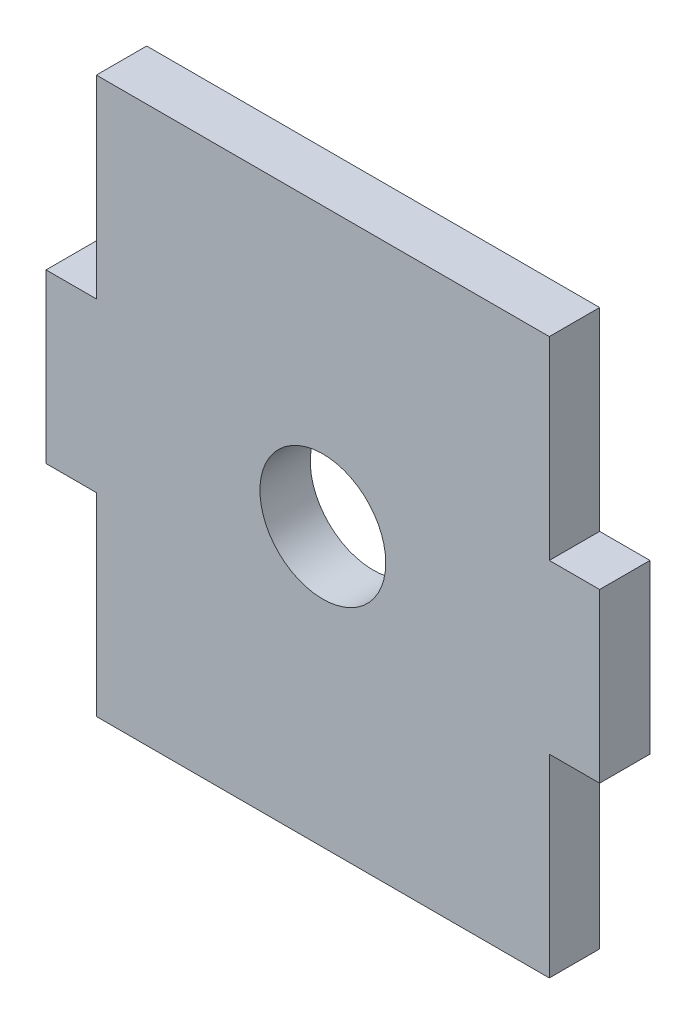
ISO-10303-21;
HEADER;
FILE_DESCRIPTION(('STEP AP214'),'2;1');
FILE_NAME('part.step','',(''),(''),'','','');
FILE_SCHEMA(('AUTOMOTIVE_DESIGN { 1 0 10303 214 1 1 1 1 }'));
ENDSEC;
DATA;
#1=APPLICATION_CONTEXT('core data for automotive mechanical design processes');
#2=APPLICATION_PROTOCOL_DEFINITION('international standard','automotive_design',2000,#1);
#3=PRODUCT_CONTEXT('',#1,'mechanical');
#4=PRODUCT('Part','Part','',(#3));
#5=PRODUCT_RELATED_PRODUCT_CATEGORY('part','',(#4));
#6=PRODUCT_DEFINITION_FORMATION('','',#4);
#7=PRODUCT_DEFINITION_CONTEXT('part definition',#1,'design');
#8=PRODUCT_DEFINITION('design','',#6,#7);
#9=PRODUCT_DEFINITION_SHAPE('','',#8);
#10=(LENGTH_UNIT() NAMED_UNIT(*) SI_UNIT(.MILLI.,.METRE.));
#11=(NAMED_UNIT(*) PLANE_ANGLE_UNIT() SI_UNIT($,.RADIAN.));
#12=(NAMED_UNIT(*) SI_UNIT($,.STERADIAN.) SOLID_ANGLE_UNIT());
#13=UNCERTAINTY_MEASURE_WITH_UNIT(LENGTH_MEASURE(1.E-05),#10,'distance_accuracy_value','');
#14=(GEOMETRIC_REPRESENTATION_CONTEXT(3) GLOBAL_UNCERTAINTY_ASSIGNED_CONTEXT((#13)) GLOBAL_UNIT_ASSIGNED_CONTEXT((#10,
#11,#12)) REPRESENTATION_CONTEXT('',''));
#15=CARTESIAN_POINT('',(0.,0.,0.));
#16=DIRECTION('',(0.,0.,1.));
#17=DIRECTION('',(1.,0.,0.));
#18=AXIS2_PLACEMENT_3D('',#15,#16,#17);
#19=CARTESIAN_POINT('',(0.,0.,3.));
#20=DIRECTION('',(0.,0.,-1.));
#21=DIRECTION('',(-1.,0.,0.));
#22=AXIS2_PLACEMENT_3D('',#19,#20,#21);
#23=PLANE('',#22);
#24=DIRECTION('',(0.,1.,0.));
#25=VECTOR('',#24,1.);
#26=CARTESIAN_POINT('',(13.5,5.,3.));
#27=LINE('',#26,#25);
#28=CARTESIAN_POINT('',(13.5,5.,3.));
#29=VERTEX_POINT('',#28);
#30=CARTESIAN_POINT('',(13.5,16.556349185,3.));
#31=VERTEX_POINT('',#30);
#32=EDGE_CURVE('E176',#29,#31,#27,.T.);
#33=ORIENTED_EDGE('',*,*,#32,.T.);
#34=DIRECTION('',(-1.,0.,0.));
#35=VECTOR('',#34,1.);
#36=CARTESIAN_POINT('',(-13.5,16.556349185,3.));
#37=LINE('',#36,#35);
#38=CARTESIAN_POINT('',(-13.5,16.556349185,3.));
#39=VERTEX_POINT('',#38);
#40=EDGE_CURVE('E104',#31,#39,#37,.T.);
#41=ORIENTED_EDGE('',*,*,#40,.T.);
#42=DIRECTION('',(0.,-1.,0.));
#43=VECTOR('',#42,1.);
#44=CARTESIAN_POINT('',(-13.5,4.99999999999999,3.));
#45=LINE('',#44,#43);
#46=CARTESIAN_POINT('',(-13.5,4.99999999999999,3.));
#47=VERTEX_POINT('',#46);
#48=EDGE_CURVE('E203',#39,#47,#45,.T.);
#49=ORIENTED_EDGE('',*,*,#48,.T.);
#50=DIRECTION('',(-1.,0.,0.));
#51=VECTOR('',#50,1.);
#52=CARTESIAN_POINT('',(-16.5,4.99999999999999,3.));
#53=LINE('',#52,#51);
#54=CARTESIAN_POINT('',(-16.5,4.99999999999999,3.));
#55=VERTEX_POINT('',#54);
#56=EDGE_CURVE('E222',#47,#55,#53,.T.);
#57=ORIENTED_EDGE('',*,*,#56,.T.);
#58=DIRECTION('',(0.,-1.,0.));
#59=VECTOR('',#58,1.);
#60=CARTESIAN_POINT('',(-16.5,-5.00000000000001,3.));
#61=LINE('',#60,#59);
#62=CARTESIAN_POINT('',(-16.5,-5.00000000000001,3.));
#63=VERTEX_POINT('',#62);
#64=EDGE_CURVE('E219',#55,#63,#61,.T.);
#65=ORIENTED_EDGE('',*,*,#64,.T.);
#66=DIRECTION('',(1.,0.,0.));
#67=VECTOR('',#66,1.);
#68=CARTESIAN_POINT('',(-16.5,-5.00000000000001,3.));
#69=LINE('',#68,#67);
#70=CARTESIAN_POINT('',(-13.5,-5.,3.));
#71=VERTEX_POINT('',#70);
#72=EDGE_CURVE('E221',#63,#71,#69,.T.);
#73=ORIENTED_EDGE('',*,*,#72,.T.);
#74=DIRECTION('',(0.,-1.,0.));
#75=VECTOR('',#74,1.);
#76=CARTESIAN_POINT('',(-13.5,-16.556349185,3.));
#77=LINE('',#76,#75);
#78=CARTESIAN_POINT('',(-13.5,-16.556349185,3.));
#79=VERTEX_POINT('',#78);
#80=EDGE_CURVE('E224',#71,#79,#77,.T.);
#81=ORIENTED_EDGE('',*,*,#80,.T.);
#82=DIRECTION('',(1.,0.,0.));
#83=VECTOR('',#82,1.);
#84=CARTESIAN_POINT('',(-13.5,-16.556349185,3.));
#85=LINE('',#84,#83);
#86=CARTESIAN_POINT('',(13.5,-16.556349185,3.));
#87=VERTEX_POINT('',#86);
#88=EDGE_CURVE('E230',#79,#87,#85,.T.);
#89=ORIENTED_EDGE('',*,*,#88,.T.);
#90=DIRECTION('',(0.,1.,0.));
#91=VECTOR('',#90,1.);
#92=CARTESIAN_POINT('',(13.5,-16.556349185,3.));
#93=LINE('',#92,#91);
#94=CARTESIAN_POINT('',(13.5,-5.,3.));
#95=VERTEX_POINT('',#94);
#96=EDGE_CURVE('E135',#87,#95,#93,.T.);
#97=ORIENTED_EDGE('',*,*,#96,.T.);
#98=DIRECTION('',(1.,0.,0.));
#99=VECTOR('',#98,1.);
#100=CARTESIAN_POINT('',(16.5,-5.,3.));
#101=LINE('',#100,#99);
#102=CARTESIAN_POINT('',(16.5,-5.,3.));
#103=VERTEX_POINT('',#102);
#104=EDGE_CURVE('E129',#95,#103,#101,.T.);
#105=ORIENTED_EDGE('',*,*,#104,.T.);
#106=DIRECTION('',(0.,1.,0.));
#107=VECTOR('',#106,1.);
#108=CARTESIAN_POINT('',(16.5,-5.,3.));
#109=LINE('',#108,#107);
#110=CARTESIAN_POINT('',(16.5,5.,3.));
#111=VERTEX_POINT('',#110);
#112=EDGE_CURVE('E133',#103,#111,#109,.T.);
#113=ORIENTED_EDGE('',*,*,#112,.T.);
#114=DIRECTION('',(-1.,0.,0.));
#115=VECTOR('',#114,1.);
#116=CARTESIAN_POINT('',(16.5,5.,3.));
#117=LINE('',#116,#115);
#118=EDGE_CURVE('E49',#111,#29,#117,.T.);
#119=ORIENTED_EDGE('',*,*,#118,.T.);
#120=EDGE_LOOP('',(#33,#41,#49,#57,#65,#73,#81,#89,#97,#105,#113,#119));
#121=FACE_BOUND('',#120,.T.);
#122=CARTESIAN_POINT('',(0.,0.,3.));
#123=DIRECTION('',(0.,0.,1.));
#124=DIRECTION('',(1.,0.,0.));
#125=AXIS2_PLACEMENT_3D('',#122,#123,#124);
#126=CIRCLE('',#125,3.75);
#127=CARTESIAN_POINT('',(3.75,0.,3.));
#128=VERTEX_POINT('',#127);
#129=EDGE_CURVE('E157',#128,#128,#126,.T.);
#130=ORIENTED_EDGE('',*,*,#129,.F.);
#131=EDGE_LOOP('',(#130));
#132=FACE_BOUND('',#131,.T.);
#133=ADVANCED_FACE('F32',(#121,#132),#23,.F.);
#134=CARTESIAN_POINT('',(0.,0.,0.));
#135=DIRECTION('',(0.,0.,-1.));
#136=DIRECTION('',(-1.,0.,0.));
#137=AXIS2_PLACEMENT_3D('',#134,#135,#136);
#138=PLANE('',#137);
#139=DIRECTION('',(0.,1.,0.));
#140=VECTOR('',#139,1.);
#141=CARTESIAN_POINT('',(13.5,5.,0.));
#142=LINE('',#141,#140);
#143=CARTESIAN_POINT('',(13.5,5.,0.));
#144=VERTEX_POINT('',#143);
#145=CARTESIAN_POINT('',(13.5,16.556349185,0.));
#146=VERTEX_POINT('',#145);
#147=EDGE_CURVE('E153',#144,#146,#142,.T.);
#148=ORIENTED_EDGE('',*,*,#147,.F.);
#149=DIRECTION('',(-1.,0.,0.));
#150=VECTOR('',#149,1.);
#151=CARTESIAN_POINT('',(16.5,5.,0.));
#152=LINE('',#151,#150);
#153=CARTESIAN_POINT('',(16.5,5.,0.));
#154=VERTEX_POINT('',#153);
#155=EDGE_CURVE('E96',#154,#144,#152,.T.);
#156=ORIENTED_EDGE('',*,*,#155,.F.);
#157=DIRECTION('',(0.,1.,0.));
#158=VECTOR('',#157,1.);
#159=CARTESIAN_POINT('',(16.5,-5.,0.));
#160=LINE('',#159,#158);
#161=CARTESIAN_POINT('',(16.5,-5.,0.));
#162=VERTEX_POINT('',#161);
#163=EDGE_CURVE('E90',#162,#154,#160,.T.);
#164=ORIENTED_EDGE('',*,*,#163,.F.);
#165=DIRECTION('',(1.,0.,0.));
#166=VECTOR('',#165,1.);
#167=CARTESIAN_POINT('',(16.5,-5.,0.));
#168=LINE('',#167,#166);
#169=CARTESIAN_POINT('',(13.5,-5.,0.));
#170=VERTEX_POINT('',#169);
#171=EDGE_CURVE('E143',#170,#162,#168,.T.);
#172=ORIENTED_EDGE('',*,*,#171,.F.);
#173=DIRECTION('',(0.,1.,0.));
#174=VECTOR('',#173,1.);
#175=CARTESIAN_POINT('',(13.5,-16.556349185,0.));
#176=LINE('',#175,#174);
#177=CARTESIAN_POINT('',(13.5,-16.556349185,0.));
#178=VERTEX_POINT('',#177);
#179=EDGE_CURVE('E171',#178,#170,#176,.T.);
#180=ORIENTED_EDGE('',*,*,#179,.F.);
#181=DIRECTION('',(1.,0.,0.));
#182=VECTOR('',#181,1.);
#183=CARTESIAN_POINT('',(-13.5,-16.556349185,0.));
#184=LINE('',#183,#182);
#185=CARTESIAN_POINT('',(-13.5,-16.556349185,0.));
#186=VERTEX_POINT('',#185);
#187=EDGE_CURVE('E169',#186,#178,#184,.T.);
#188=ORIENTED_EDGE('',*,*,#187,.F.);
#189=DIRECTION('',(0.,-1.,0.));
#190=VECTOR('',#189,1.);
#191=CARTESIAN_POINT('',(-13.5,-16.556349185,0.));
#192=LINE('',#191,#190);
#193=CARTESIAN_POINT('',(-13.5,-5.,0.));
#194=VERTEX_POINT('',#193);
#195=EDGE_CURVE('E167',#194,#186,#192,.T.);
#196=ORIENTED_EDGE('',*,*,#195,.F.);
#197=DIRECTION('',(1.,0.,0.));
#198=VECTOR('',#197,1.);
#199=CARTESIAN_POINT('',(-16.5,-5.00000000000001,0.));
#200=LINE('',#199,#198);
#201=CARTESIAN_POINT('',(-16.5,-5.00000000000001,0.));
#202=VERTEX_POINT('',#201);
#203=EDGE_CURVE('E165',#202,#194,#200,.T.);
#204=ORIENTED_EDGE('',*,*,#203,.F.);
#205=DIRECTION('',(0.,-1.,0.));
#206=VECTOR('',#205,1.);
#207=CARTESIAN_POINT('',(-16.5,-5.00000000000001,0.));
#208=LINE('',#207,#206);
#209=CARTESIAN_POINT('',(-16.5,4.99999999999999,0.));
#210=VERTEX_POINT('',#209);
#211=EDGE_CURVE('E163',#210,#202,#208,.T.);
#212=ORIENTED_EDGE('',*,*,#211,.F.);
#213=DIRECTION('',(-1.,0.,0.));
#214=VECTOR('',#213,1.);
#215=CARTESIAN_POINT('',(-16.5,4.99999999999999,0.));
#216=LINE('',#215,#214);
#217=CARTESIAN_POINT('',(-13.5,4.99999999999999,0.));
#218=VERTEX_POINT('',#217);
#219=EDGE_CURVE('E161',#218,#210,#216,.T.);
#220=ORIENTED_EDGE('',*,*,#219,.F.);
#221=DIRECTION('',(0.,-1.,0.));
#222=VECTOR('',#221,1.);
#223=CARTESIAN_POINT('',(-13.5,4.99999999999999,0.));
#224=LINE('',#223,#222);
#225=CARTESIAN_POINT('',(-13.5,16.556349185,0.));
#226=VERTEX_POINT('',#225);
#227=EDGE_CURVE('E159',#226,#218,#224,.T.);
#228=ORIENTED_EDGE('',*,*,#227,.F.);
#229=DIRECTION('',(-1.,0.,0.));
#230=VECTOR('',#229,1.);
#231=CARTESIAN_POINT('',(-13.5,16.556349185,0.));
#232=LINE('',#231,#230);
#233=EDGE_CURVE('E156',#146,#226,#232,.T.);
#234=ORIENTED_EDGE('',*,*,#233,.F.);
#235=EDGE_LOOP('',(#148,#156,#164,#172,#180,#188,#196,#204,#212,#220,#228,#234));
#236=FACE_BOUND('',#235,.T.);
#237=CARTESIAN_POINT('',(0.,0.,0.));
#238=DIRECTION('',(0.,0.,1.));
#239=DIRECTION('',(1.,0.,0.));
#240=AXIS2_PLACEMENT_3D('',#237,#238,#239);
#241=CIRCLE('',#240,3.75);
#242=CARTESIAN_POINT('',(3.75,0.,0.));
#243=VERTEX_POINT('',#242);
#244=EDGE_CURVE('E377',#243,#243,#241,.T.);
#245=ORIENTED_EDGE('',*,*,#244,.T.);
#246=EDGE_LOOP('',(#245));
#247=FACE_BOUND('',#246,.T.);
#248=ADVANCED_FACE('F207',(#236,#247),#138,.T.);
#249=CARTESIAN_POINT('',(13.5,5.,3.));
#250=DIRECTION('',(-1.,0.,0.));
#251=DIRECTION('',(0.,-1.,0.));
#252=AXIS2_PLACEMENT_3D('',#249,#250,#251);
#253=PLANE('',#252);
#254=ORIENTED_EDGE('',*,*,#147,.T.);
#255=DIRECTION('',(0.,0.,-1.));
#256=VECTOR('',#255,1.);
#257=CARTESIAN_POINT('',(13.5,16.556349185,3.));
#258=LINE('',#257,#256);
#259=EDGE_CURVE('E11',#31,#146,#258,.T.);
#260=ORIENTED_EDGE('',*,*,#259,.F.);
#261=ORIENTED_EDGE('',*,*,#32,.F.);
#262=DIRECTION('',(0.,0.,-1.));
#263=VECTOR('',#262,1.);
#264=CARTESIAN_POINT('',(13.5,5.,3.));
#265=LINE('',#264,#263);
#266=EDGE_CURVE('E149',#29,#144,#265,.T.);
#267=ORIENTED_EDGE('',*,*,#266,.T.);
#268=EDGE_LOOP('',(#254,#260,#261,#267));
#269=FACE_BOUND('',#268,.T.);
#270=ADVANCED_FACE('F34',(#269),#253,.F.);
#271=CARTESIAN_POINT('',(-13.5,16.556349185,3.));
#272=DIRECTION('',(0.,-1.,0.));
#273=DIRECTION('',(0.,0.,-1.));
#274=AXIS2_PLACEMENT_3D('',#271,#272,#273);
#275=PLANE('',#274);
#276=ORIENTED_EDGE('',*,*,#233,.T.);
#277=DIRECTION('',(0.,0.,-1.));
#278=VECTOR('',#277,1.);
#279=CARTESIAN_POINT('',(-13.5,16.556349185,3.));
#280=LINE('',#279,#278);
#281=EDGE_CURVE('E41',#39,#226,#280,.T.);
#282=ORIENTED_EDGE('',*,*,#281,.F.);
#283=ORIENTED_EDGE('',*,*,#40,.F.);
#284=ORIENTED_EDGE('',*,*,#259,.T.);
#285=EDGE_LOOP('',(#276,#282,#283,#284));
#286=FACE_BOUND('',#285,.T.);
#287=ADVANCED_FACE('F264',(#286),#275,.F.);
#288=CARTESIAN_POINT('',(-13.5,4.99999999999999,3.));
#289=DIRECTION('',(1.,0.,0.));
#290=DIRECTION('',(0.,1.,0.));
#291=AXIS2_PLACEMENT_3D('',#288,#289,#290);
#292=PLANE('',#291);
#293=ORIENTED_EDGE('',*,*,#227,.T.);
#294=DIRECTION('',(0.,0.,-1.));
#295=VECTOR('',#294,1.);
#296=CARTESIAN_POINT('',(-13.5,4.99999999999999,3.));
#297=LINE('',#296,#295);
#298=EDGE_CURVE('E195',#47,#218,#297,.T.);
#299=ORIENTED_EDGE('',*,*,#298,.F.);
#300=ORIENTED_EDGE('',*,*,#48,.F.);
#301=ORIENTED_EDGE('',*,*,#281,.T.);
#302=EDGE_LOOP('',(#293,#299,#300,#301));
#303=FACE_BOUND('',#302,.T.);
#304=ADVANCED_FACE('F201',(#303),#292,.F.);
#305=CARTESIAN_POINT('',(-16.5,4.99999999999999,3.));
#306=DIRECTION('',(0.,-1.,0.));
#307=DIRECTION('',(1.,0.,0.));
#308=AXIS2_PLACEMENT_3D('',#305,#306,#307);
#309=PLANE('',#308);
#310=ORIENTED_EDGE('',*,*,#219,.T.);
#311=DIRECTION('',(0.,0.,-1.));
#312=VECTOR('',#311,1.);
#313=CARTESIAN_POINT('',(-16.5,4.99999999999999,3.));
#314=LINE('',#313,#312);
#315=EDGE_CURVE('E192',#55,#210,#314,.T.);
#316=ORIENTED_EDGE('',*,*,#315,.F.);
#317=ORIENTED_EDGE('',*,*,#56,.F.);
#318=ORIENTED_EDGE('',*,*,#298,.T.);
#319=EDGE_LOOP('',(#310,#316,#317,#318));
#320=FACE_BOUND('',#319,.T.);
#321=ADVANCED_FACE('F213',(#320),#309,.F.);
#322=CARTESIAN_POINT('',(-16.5,-5.00000000000001,3.));
#323=DIRECTION('',(1.,0.,0.));
#324=DIRECTION('',(0.,0.,-1.));
#325=AXIS2_PLACEMENT_3D('',#322,#323,#324);
#326=PLANE('',#325);
#327=ORIENTED_EDGE('',*,*,#211,.T.);
#328=DIRECTION('',(0.,0.,-1.));
#329=VECTOR('',#328,1.);
#330=CARTESIAN_POINT('',(-16.5,-5.00000000000001,3.));
#331=LINE('',#330,#329);
#332=EDGE_CURVE('E189',#63,#202,#331,.T.);
#333=ORIENTED_EDGE('',*,*,#332,.F.);
#334=ORIENTED_EDGE('',*,*,#64,.F.);
#335=ORIENTED_EDGE('',*,*,#315,.T.);
#336=EDGE_LOOP('',(#327,#333,#334,#335));
#337=FACE_BOUND('',#336,.T.);
#338=ADVANCED_FACE('F217',(#337),#326,.F.);
#339=CARTESIAN_POINT('',(-16.5,-5.00000000000001,3.));
#340=DIRECTION('',(0.,1.,0.));
#341=DIRECTION('',(-1.,0.,0.));
#342=AXIS2_PLACEMENT_3D('',#339,#340,#341);
#343=PLANE('',#342);
#344=ORIENTED_EDGE('',*,*,#203,.T.);
#345=DIRECTION('',(0.,0.,-1.));
#346=VECTOR('',#345,1.);
#347=CARTESIAN_POINT('',(-13.5,-5.,3.));
#348=LINE('',#347,#346);
#349=EDGE_CURVE('E186',#71,#194,#348,.T.);
#350=ORIENTED_EDGE('',*,*,#349,.F.);
#351=ORIENTED_EDGE('',*,*,#72,.F.);
#352=ORIENTED_EDGE('',*,*,#332,.T.);
#353=EDGE_LOOP('',(#344,#350,#351,#352));
#354=FACE_BOUND('',#353,.T.);
#355=ADVANCED_FACE('F277',(#354),#343,.F.);
#356=CARTESIAN_POINT('',(-13.5,-16.556349185,3.));
#357=DIRECTION('',(1.,0.,0.));
#358=DIRECTION('',(0.,1.,0.));
#359=AXIS2_PLACEMENT_3D('',#356,#357,#358);
#360=PLANE('',#359);
#361=ORIENTED_EDGE('',*,*,#195,.T.);
#362=DIRECTION('',(0.,0.,-1.));
#363=VECTOR('',#362,1.);
#364=CARTESIAN_POINT('',(-13.5,-16.556349185,3.));
#365=LINE('',#364,#363);
#366=EDGE_CURVE('E183',#79,#186,#365,.T.);
#367=ORIENTED_EDGE('',*,*,#366,.F.);
#368=ORIENTED_EDGE('',*,*,#80,.F.);
#369=ORIENTED_EDGE('',*,*,#349,.T.);
#370=EDGE_LOOP('',(#361,#367,#368,#369));
#371=FACE_BOUND('',#370,.T.);
#372=ADVANCED_FACE('F280',(#371),#360,.F.);
#373=CARTESIAN_POINT('',(-13.5,-16.556349185,3.));
#374=DIRECTION('',(0.,1.,0.));
#375=DIRECTION('',(-1.,0.,0.));
#376=AXIS2_PLACEMENT_3D('',#373,#374,#375);
#377=PLANE('',#376);
#378=ORIENTED_EDGE('',*,*,#187,.T.);
#379=DIRECTION('',(0.,0.,-1.));
#380=VECTOR('',#379,1.);
#381=CARTESIAN_POINT('',(13.5,-16.556349185,3.));
#382=LINE('',#381,#380);
#383=EDGE_CURVE('E180',#87,#178,#382,.T.);
#384=ORIENTED_EDGE('',*,*,#383,.F.);
#385=ORIENTED_EDGE('',*,*,#88,.F.);
#386=ORIENTED_EDGE('',*,*,#366,.T.);
#387=EDGE_LOOP('',(#378,#384,#385,#386));
#388=FACE_BOUND('',#387,.T.);
#389=ADVANCED_FACE('F236',(#388),#377,.F.);
#390=CARTESIAN_POINT('',(13.5,-16.556349185,3.));
#391=DIRECTION('',(-1.,0.,0.));
#392=DIRECTION('',(0.,-1.,0.));
#393=AXIS2_PLACEMENT_3D('',#390,#391,#392);
#394=PLANE('',#393);
#395=ORIENTED_EDGE('',*,*,#179,.T.);
#396=DIRECTION('',(0.,0.,-1.));
#397=VECTOR('',#396,1.);
#398=CARTESIAN_POINT('',(13.5,-5.,3.));
#399=LINE('',#398,#397);
#400=EDGE_CURVE('E144',#95,#170,#399,.T.);
#401=ORIENTED_EDGE('',*,*,#400,.F.);
#402=ORIENTED_EDGE('',*,*,#96,.F.);
#403=ORIENTED_EDGE('',*,*,#383,.T.);
#404=EDGE_LOOP('',(#395,#401,#402,#403));
#405=FACE_BOUND('',#404,.T.);
#406=ADVANCED_FACE('F240',(#405),#394,.F.);
#407=CARTESIAN_POINT('',(16.5,-5.,3.));
#408=DIRECTION('',(0.,1.,0.));
#409=DIRECTION('',(-1.,0.,0.));
#410=AXIS2_PLACEMENT_3D('',#407,#408,#409);
#411=PLANE('',#410);
#412=ORIENTED_EDGE('',*,*,#171,.T.);
#413=DIRECTION('',(0.,0.,-1.));
#414=VECTOR('',#413,1.);
#415=CARTESIAN_POINT('',(16.5,-5.,3.));
#416=LINE('',#415,#414);
#417=EDGE_CURVE('E140',#103,#162,#416,.T.);
#418=ORIENTED_EDGE('',*,*,#417,.F.);
#419=ORIENTED_EDGE('',*,*,#104,.F.);
#420=ORIENTED_EDGE('',*,*,#400,.T.);
#421=EDGE_LOOP('',(#412,#418,#419,#420));
#422=FACE_BOUND('',#421,.T.);
#423=ADVANCED_FACE('F141',(#422),#411,.F.);
#424=CARTESIAN_POINT('',(16.5,-5.,3.));
#425=DIRECTION('',(-1.,0.,0.));
#426=DIRECTION('',(0.,0.,1.));
#427=AXIS2_PLACEMENT_3D('',#424,#425,#426);
#428=PLANE('',#427);
#429=ORIENTED_EDGE('',*,*,#163,.T.);
#430=DIRECTION('',(0.,0.,-1.));
#431=VECTOR('',#430,1.);
#432=CARTESIAN_POINT('',(16.5,5.,3.));
#433=LINE('',#432,#431);
#434=EDGE_CURVE('E145',#111,#154,#433,.T.);
#435=ORIENTED_EDGE('',*,*,#434,.F.);
#436=ORIENTED_EDGE('',*,*,#112,.F.);
#437=ORIENTED_EDGE('',*,*,#417,.T.);
#438=EDGE_LOOP('',(#429,#435,#436,#437));
#439=FACE_BOUND('',#438,.T.);
#440=ADVANCED_FACE('F147',(#439),#428,.F.);
#441=CARTESIAN_POINT('',(16.5,5.,3.));
#442=DIRECTION('',(0.,-1.,0.));
#443=DIRECTION('',(1.,0.,0.));
#444=AXIS2_PLACEMENT_3D('',#441,#442,#443);
#445=PLANE('',#444);
#446=ORIENTED_EDGE('',*,*,#155,.T.);
#447=ORIENTED_EDGE('',*,*,#266,.F.);
#448=ORIENTED_EDGE('',*,*,#118,.F.);
#449=ORIENTED_EDGE('',*,*,#434,.T.);
#450=EDGE_LOOP('',(#446,#447,#448,#449));
#451=FACE_BOUND('',#450,.T.);
#452=ADVANCED_FACE('F244',(#451),#445,.F.);
#453=CARTESIAN_POINT('',(0.,0.,3.));
#454=DIRECTION('',(0.,0.,-1.));
#455=DIRECTION('',(-1.,0.,0.));
#456=AXIS2_PLACEMENT_3D('',#453,#454,#455);
#457=CYLINDRICAL_SURFACE('',#456,3.75);
#458=ORIENTED_EDGE('',*,*,#129,.T.);
#459=EDGE_LOOP('',(#458));
#460=FACE_BOUND('',#459,.T.);
#461=ORIENTED_EDGE('',*,*,#244,.F.);
#462=EDGE_LOOP('',(#461));
#463=FACE_BOUND('',#462,.T.);
#464=ADVANCED_FACE('F246',(#460,#463),#457,.F.);
#465=CLOSED_SHELL('',(#133,#248,#270,#287,#304,#321,#338,#355,#372,#389,#406,#423,#440,#452,#464));
#466=MANIFOLD_SOLID_BREP('B2',#465);
#467=ADVANCED_BREP_SHAPE_REPRESENTATION('',(#18,#466),#14);
#468=SHAPE_DEFINITION_REPRESENTATION(#9,#467);
ENDSEC;
END-ISO-10303-21;
